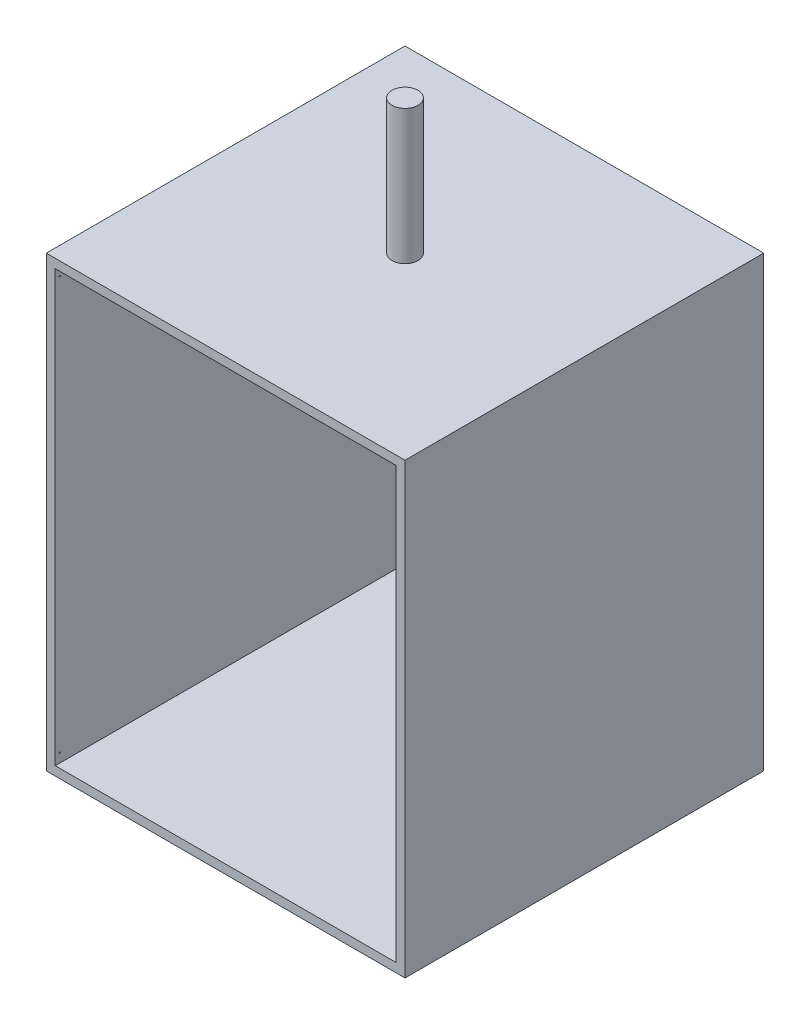
ISO-10303-21;
HEADER;
FILE_DESCRIPTION(('STEP AP214'),'2;1');
FILE_NAME('part.step','',(''),(''),'','','');
FILE_SCHEMA(('AUTOMOTIVE_DESIGN { 1 0 10303 214 1 1 1 1 }'));
ENDSEC;
DATA;
#1=APPLICATION_CONTEXT('core data for automotive mechanical design processes');
#2=APPLICATION_PROTOCOL_DEFINITION('international standard','automotive_design',2000,#1);
#3=PRODUCT_CONTEXT('',#1,'mechanical');
#4=PRODUCT('Part','Part','',(#3));
#5=PRODUCT_RELATED_PRODUCT_CATEGORY('part','',(#4));
#6=PRODUCT_DEFINITION_FORMATION('','',#4);
#7=PRODUCT_DEFINITION_CONTEXT('part definition',#1,'design');
#8=PRODUCT_DEFINITION('design','',#6,#7);
#9=PRODUCT_DEFINITION_SHAPE('','',#8);
#10=(LENGTH_UNIT() NAMED_UNIT(*) SI_UNIT(.MILLI.,.METRE.));
#11=(NAMED_UNIT(*) PLANE_ANGLE_UNIT() SI_UNIT($,.RADIAN.));
#12=(NAMED_UNIT(*) SI_UNIT($,.STERADIAN.) SOLID_ANGLE_UNIT());
#13=UNCERTAINTY_MEASURE_WITH_UNIT(LENGTH_MEASURE(1.E-05),#10,'distance_accuracy_value','');
#14=(GEOMETRIC_REPRESENTATION_CONTEXT(3) GLOBAL_UNCERTAINTY_ASSIGNED_CONTEXT((#13)) GLOBAL_UNIT_ASSIGNED_CONTEXT((#10,
#11,#12)) REPRESENTATION_CONTEXT('',''));
#15=CARTESIAN_POINT('',(0.,0.,0.));
#16=DIRECTION('',(0.,0.,1.));
#17=DIRECTION('',(1.,0.,0.));
#18=AXIS2_PLACEMENT_3D('',#15,#16,#17);
#19=CARTESIAN_POINT('',(200.,-250.,-400.));
#20=DIRECTION('',(1.,0.,0.));
#21=DIRECTION('',(0.,0.,-1.));
#22=AXIS2_PLACEMENT_3D('',#19,#20,#21);
#23=PLANE('',#22);
#24=DIRECTION('',(0.,1.,0.));
#25=VECTOR('',#24,1.);
#26=CARTESIAN_POINT('',(200.,-250.,0.));
#27=LINE('',#26,#25);
#28=CARTESIAN_POINT('',(200.,-250.,0.));
#29=VERTEX_POINT('',#28);
#30=CARTESIAN_POINT('',(200.,250.,0.));
#31=VERTEX_POINT('',#30);
#32=EDGE_CURVE('E167',#29,#31,#27,.T.);
#33=ORIENTED_EDGE('',*,*,#32,.F.);
#34=DIRECTION('',(0.,0.,1.));
#35=VECTOR('',#34,1.);
#36=CARTESIAN_POINT('',(200.,-250.,-400.));
#37=LINE('',#36,#35);
#38=CARTESIAN_POINT('',(200.,-250.,-400.));
#39=VERTEX_POINT('',#38);
#40=EDGE_CURVE('E11',#39,#29,#37,.T.);
#41=ORIENTED_EDGE('',*,*,#40,.F.);
#42=DIRECTION('',(0.,1.,0.));
#43=VECTOR('',#42,1.);
#44=CARTESIAN_POINT('',(200.,-250.,-400.));
#45=LINE('',#44,#43);
#46=CARTESIAN_POINT('',(200.,250.,-400.));
#47=VERTEX_POINT('',#46);
#48=EDGE_CURVE('E173',#39,#47,#45,.T.);
#49=ORIENTED_EDGE('',*,*,#48,.T.);
#50=DIRECTION('',(0.,0.,1.));
#51=VECTOR('',#50,1.);
#52=CARTESIAN_POINT('',(200.,250.,-400.));
#53=LINE('',#52,#51);
#54=EDGE_CURVE('E48',#47,#31,#53,.T.);
#55=ORIENTED_EDGE('',*,*,#54,.T.);
#56=EDGE_LOOP('',(#33,#41,#49,#55));
#57=FACE_BOUND('',#56,.T.);
#58=ADVANCED_FACE('F45',(#57),#23,.T.);
#59=CARTESIAN_POINT('',(-200.,-250.,-400.));
#60=DIRECTION('',(0.,-1.,0.));
#61=DIRECTION('',(0.,0.,-1.));
#62=AXIS2_PLACEMENT_3D('',#59,#60,#61);
#63=PLANE('',#62);
#64=DIRECTION('',(1.,0.,0.));
#65=VECTOR('',#64,1.);
#66=CARTESIAN_POINT('',(-200.,-250.,0.));
#67=LINE('',#66,#65);
#68=CARTESIAN_POINT('',(-200.,-250.,0.));
#69=VERTEX_POINT('',#68);
#70=EDGE_CURVE('E177',#69,#29,#67,.T.);
#71=ORIENTED_EDGE('',*,*,#70,.F.);
#72=DIRECTION('',(0.,0.,1.));
#73=VECTOR('',#72,1.);
#74=CARTESIAN_POINT('',(-200.,-250.,-400.));
#75=LINE('',#74,#73);
#76=CARTESIAN_POINT('',(-200.,-250.,-400.));
#77=VERTEX_POINT('',#76);
#78=EDGE_CURVE('E54',#77,#69,#75,.T.);
#79=ORIENTED_EDGE('',*,*,#78,.F.);
#80=DIRECTION('',(1.,0.,0.));
#81=VECTOR('',#80,1.);
#82=CARTESIAN_POINT('',(-200.,-250.,-400.));
#83=LINE('',#82,#81);
#84=EDGE_CURVE('E184',#77,#39,#83,.T.);
#85=ORIENTED_EDGE('',*,*,#84,.T.);
#86=ORIENTED_EDGE('',*,*,#40,.T.);
#87=EDGE_LOOP('',(#71,#79,#85,#86));
#88=FACE_BOUND('',#87,.T.);
#89=ADVANCED_FACE('F209',(#88),#63,.T.);
#90=CARTESIAN_POINT('',(-200.,-250.,-400.));
#91=DIRECTION('',(-1.,0.,0.));
#92=DIRECTION('',(0.,0.,1.));
#93=AXIS2_PLACEMENT_3D('',#90,#91,#92);
#94=PLANE('',#93);
#95=DIRECTION('',(0.,-1.,0.));
#96=VECTOR('',#95,1.);
#97=CARTESIAN_POINT('',(-200.,-250.,0.));
#98=LINE('',#97,#96);
#99=CARTESIAN_POINT('',(-200.,250.,0.));
#100=VERTEX_POINT('',#99);
#101=EDGE_CURVE('E194',#100,#69,#98,.T.);
#102=ORIENTED_EDGE('',*,*,#101,.F.);
#103=DIRECTION('',(0.,0.,1.));
#104=VECTOR('',#103,1.);
#105=CARTESIAN_POINT('',(-200.,250.,-400.));
#106=LINE('',#105,#104);
#107=CARTESIAN_POINT('',(-200.,250.,-400.));
#108=VERTEX_POINT('',#107);
#109=EDGE_CURVE('E202',#108,#100,#106,.T.);
#110=ORIENTED_EDGE('',*,*,#109,.F.);
#111=DIRECTION('',(0.,-1.,0.));
#112=VECTOR('',#111,1.);
#113=CARTESIAN_POINT('',(-200.,-250.,-400.));
#114=LINE('',#113,#112);
#115=EDGE_CURVE('E180',#108,#77,#114,.T.);
#116=ORIENTED_EDGE('',*,*,#115,.T.);
#117=ORIENTED_EDGE('',*,*,#78,.T.);
#118=EDGE_LOOP('',(#102,#110,#116,#117));
#119=FACE_BOUND('',#118,.T.);
#120=ADVANCED_FACE('F213',(#119),#94,.T.);
#121=CARTESIAN_POINT('',(-200.,250.,-400.));
#122=DIRECTION('',(0.,1.,0.));
#123=DIRECTION('',(0.,0.,1.));
#124=AXIS2_PLACEMENT_3D('',#121,#122,#123);
#125=PLANE('',#124);
#126=CARTESIAN_POINT('',(0.,250.,-200.));
#127=DIRECTION('',(0.,1.,0.));
#128=DIRECTION('',(0.,0.,1.));
#129=AXIS2_PLACEMENT_3D('',#126,#127,#128);
#130=CIRCLE('',#129,14.5);
#131=CARTESIAN_POINT('',(0.,250.,-185.5));
#132=VERTEX_POINT('',#131);
#133=EDGE_CURVE('E447',#132,#132,#130,.T.);
#134=ORIENTED_EDGE('',*,*,#133,.F.);
#135=EDGE_LOOP('',(#134));
#136=FACE_BOUND('',#135,.T.);
#137=DIRECTION('',(-1.,0.,0.));
#138=VECTOR('',#137,1.);
#139=CARTESIAN_POINT('',(-200.,250.,0.));
#140=LINE('',#139,#138);
#141=EDGE_CURVE('E190',#31,#100,#140,.T.);
#142=ORIENTED_EDGE('',*,*,#141,.F.);
#143=ORIENTED_EDGE('',*,*,#54,.F.);
#144=DIRECTION('',(-1.,0.,0.));
#145=VECTOR('',#144,1.);
#146=CARTESIAN_POINT('',(-200.,250.,-400.));
#147=LINE('',#146,#145);
#148=EDGE_CURVE('E176',#47,#108,#147,.T.);
#149=ORIENTED_EDGE('',*,*,#148,.T.);
#150=ORIENTED_EDGE('',*,*,#109,.T.);
#151=EDGE_LOOP('',(#142,#143,#149,#150));
#152=FACE_BOUND('',#151,.T.);
#153=ADVANCED_FACE('F206',(#136,#152),#125,.T.);
#154=CARTESIAN_POINT('',(0.,0.,-400.));
#155=DIRECTION('',(0.,0.,-1.));
#156=DIRECTION('',(-1.,0.,0.));
#157=AXIS2_PLACEMENT_3D('',#154,#155,#156);
#158=PLANE('',#157);
#159=CARTESIAN_POINT('',(0.,0.,-400.));
#160=DIRECTION('',(0.,0.,-1.));
#161=DIRECTION('',(-1.,0.,0.));
#162=AXIS2_PLACEMENT_3D('',#159,#160,#161);
#163=CIRCLE('',#162,25.5);
#164=CARTESIAN_POINT('',(-25.5,0.,-400.));
#165=VERTEX_POINT('',#164);
#166=EDGE_CURVE('E148',#165,#165,#163,.T.);
#167=ORIENTED_EDGE('',*,*,#166,.F.);
#168=EDGE_LOOP('',(#167));
#169=FACE_BOUND('',#168,.T.);
#170=ORIENTED_EDGE('',*,*,#48,.F.);
#171=ORIENTED_EDGE('',*,*,#84,.F.);
#172=ORIENTED_EDGE('',*,*,#115,.F.);
#173=ORIENTED_EDGE('',*,*,#148,.F.);
#174=EDGE_LOOP('',(#170,#171,#172,#173));
#175=FACE_BOUND('',#174,.T.);
#176=ADVANCED_FACE('F215',(#169,#175),#158,.T.);
#177=CARTESIAN_POINT('',(0.,0.,0.));
#178=DIRECTION('',(0.,0.,-1.));
#179=DIRECTION('',(-1.,0.,0.));
#180=AXIS2_PLACEMENT_3D('',#177,#178,#179);
#181=PLANE('',#180);
#182=DIRECTION('',(1.,0.,0.));
#183=VECTOR('',#182,1.);
#184=CARTESIAN_POINT('',(190.,-240.,0.));
#185=LINE('',#184,#183);
#186=CARTESIAN_POINT('',(-190.,-240.,0.));
#187=VERTEX_POINT('',#186);
#188=CARTESIAN_POINT('',(190.,-240.,0.));
#189=VERTEX_POINT('',#188);
#190=EDGE_CURVE('E157',#187,#189,#185,.T.);
#191=ORIENTED_EDGE('',*,*,#190,.F.);
#192=DIRECTION('',(0.,-1.,0.));
#193=VECTOR('',#192,1.);
#194=CARTESIAN_POINT('',(-190.,-240.,0.));
#195=LINE('',#194,#193);
#196=CARTESIAN_POINT('',(-190.,240.,0.));
#197=VERTEX_POINT('',#196);
#198=EDGE_CURVE('E62',#197,#187,#195,.T.);
#199=ORIENTED_EDGE('',*,*,#198,.F.);
#200=DIRECTION('',(-1.,0.,0.));
#201=VECTOR('',#200,1.);
#202=CARTESIAN_POINT('',(190.,240.,0.));
#203=LINE('',#202,#201);
#204=CARTESIAN_POINT('',(190.,240.,0.));
#205=VERTEX_POINT('',#204);
#206=EDGE_CURVE('E141',#205,#197,#203,.T.);
#207=ORIENTED_EDGE('',*,*,#206,.F.);
#208=DIRECTION('',(0.,1.,0.));
#209=VECTOR('',#208,1.);
#210=CARTESIAN_POINT('',(190.,-240.,0.));
#211=LINE('',#210,#209);
#212=EDGE_CURVE('E145',#189,#205,#211,.T.);
#213=ORIENTED_EDGE('',*,*,#212,.F.);
#214=EDGE_LOOP('',(#191,#199,#207,#213));
#215=FACE_BOUND('',#214,.T.);
#216=ORIENTED_EDGE('',*,*,#32,.T.);
#217=ORIENTED_EDGE('',*,*,#141,.T.);
#218=ORIENTED_EDGE('',*,*,#101,.T.);
#219=ORIENTED_EDGE('',*,*,#70,.T.);
#220=EDGE_LOOP('',(#216,#217,#218,#219));
#221=FACE_BOUND('',#220,.T.);
#222=ADVANCED_FACE('F208',(#215,#221),#181,.F.);
#223=CARTESIAN_POINT('',(-190.,-240.,-395.));
#224=DIRECTION('',(-1.,0.,0.));
#225=DIRECTION('',(0.,0.,1.));
#226=AXIS2_PLACEMENT_3D('',#223,#224,#225);
#227=PLANE('',#226);
#228=CARTESIAN_POINT('',(-190.,-230.,-5.00000000000006));
#229=DIRECTION('',(1.,0.,0.));
#230=DIRECTION('',(0.,0.,-1.));
#231=AXIS2_PLACEMENT_3D('',#228,#229,#230);
#232=CIRCLE('',#231,0.750000000000001);
#233=CARTESIAN_POINT('',(-190.,-230.,-5.75000000000006));
#234=VERTEX_POINT('',#233);
#235=EDGE_CURVE('E425',#234,#234,#232,.T.);
#236=ORIENTED_EDGE('',*,*,#235,.F.);
#237=EDGE_LOOP('',(#236));
#238=FACE_BOUND('',#237,.T.);
#239=CARTESIAN_POINT('',(-190.,230.,-5.));
#240=DIRECTION('',(1.,0.,0.));
#241=DIRECTION('',(0.,0.,-1.));
#242=AXIS2_PLACEMENT_3D('',#239,#240,#241);
#243=CIRCLE('',#242,0.75);
#244=CARTESIAN_POINT('',(-190.,230.,-5.75000000000001));
#245=VERTEX_POINT('',#244);
#246=EDGE_CURVE('E428',#245,#245,#243,.T.);
#247=ORIENTED_EDGE('',*,*,#246,.F.);
#248=EDGE_LOOP('',(#247));
#249=FACE_BOUND('',#248,.T.);
#250=ORIENTED_EDGE('',*,*,#198,.T.);
#251=DIRECTION('',(0.,0.,1.));
#252=VECTOR('',#251,1.);
#253=CARTESIAN_POINT('',(-190.,-240.,-395.));
#254=LINE('',#253,#252);
#255=CARTESIAN_POINT('',(-190.,-240.,-395.));
#256=VERTEX_POINT('',#255);
#257=EDGE_CURVE('E116',#256,#187,#254,.T.);
#258=ORIENTED_EDGE('',*,*,#257,.F.);
#259=DIRECTION('',(0.,-1.,0.));
#260=VECTOR('',#259,1.);
#261=CARTESIAN_POINT('',(-190.,-240.,-395.));
#262=LINE('',#261,#260);
#263=CARTESIAN_POINT('',(-190.,240.,-395.));
#264=VERTEX_POINT('',#263);
#265=EDGE_CURVE('E120',#264,#256,#262,.T.);
#266=ORIENTED_EDGE('',*,*,#265,.F.);
#267=DIRECTION('',(0.,0.,1.));
#268=VECTOR('',#267,1.);
#269=CARTESIAN_POINT('',(-190.,240.,-395.));
#270=LINE('',#269,#268);
#271=EDGE_CURVE('E164',#264,#197,#270,.T.);
#272=ORIENTED_EDGE('',*,*,#271,.T.);
#273=EDGE_LOOP('',(#250,#258,#266,#272));
#274=FACE_BOUND('',#273,.T.);
#275=ADVANCED_FACE('F118',(#238,#249,#274),#227,.F.);
#276=CARTESIAN_POINT('',(190.,240.,-395.));
#277=DIRECTION('',(0.,1.,0.));
#278=DIRECTION('',(0.,0.,1.));
#279=AXIS2_PLACEMENT_3D('',#276,#277,#278);
#280=PLANE('',#279);
#281=ORIENTED_EDGE('',*,*,#206,.T.);
#282=ORIENTED_EDGE('',*,*,#271,.F.);
#283=DIRECTION('',(-1.,0.,0.));
#284=VECTOR('',#283,1.);
#285=CARTESIAN_POINT('',(190.,240.,-395.));
#286=LINE('',#285,#284);
#287=CARTESIAN_POINT('',(190.,240.,-395.));
#288=VERTEX_POINT('',#287);
#289=EDGE_CURVE('E127',#288,#264,#286,.T.);
#290=ORIENTED_EDGE('',*,*,#289,.F.);
#291=DIRECTION('',(0.,0.,1.));
#292=VECTOR('',#291,1.);
#293=CARTESIAN_POINT('',(190.,240.,-395.));
#294=LINE('',#293,#292);
#295=EDGE_CURVE('E168',#288,#205,#294,.T.);
#296=ORIENTED_EDGE('',*,*,#295,.T.);
#297=EDGE_LOOP('',(#281,#282,#290,#296));
#298=FACE_BOUND('',#297,.T.);
#299=ADVANCED_FACE('F252',(#298),#280,.F.);
#300=CARTESIAN_POINT('',(190.,-240.,-395.));
#301=DIRECTION('',(1.,0.,0.));
#302=DIRECTION('',(0.,0.,-1.));
#303=AXIS2_PLACEMENT_3D('',#300,#301,#302);
#304=PLANE('',#303);
#305=CARTESIAN_POINT('',(190.,-230.,-4.99999999999995));
#306=DIRECTION('',(-1.,0.,0.));
#307=DIRECTION('',(0.,0.,1.));
#308=AXIS2_PLACEMENT_3D('',#305,#306,#307);
#309=CIRCLE('',#308,0.75);
#310=CARTESIAN_POINT('',(190.,-230.,-4.24999999999994));
#311=VERTEX_POINT('',#310);
#312=EDGE_CURVE('E488',#311,#311,#309,.T.);
#313=ORIENTED_EDGE('',*,*,#312,.F.);
#314=EDGE_LOOP('',(#313));
#315=FACE_BOUND('',#314,.T.);
#316=CARTESIAN_POINT('',(190.,230.,-5.));
#317=DIRECTION('',(-1.,0.,0.));
#318=DIRECTION('',(0.,0.,1.));
#319=AXIS2_PLACEMENT_3D('',#316,#317,#318);
#320=CIRCLE('',#319,0.750000000000001);
#321=CARTESIAN_POINT('',(190.,230.,-4.25));
#322=VERTEX_POINT('',#321);
#323=EDGE_CURVE('E437',#322,#322,#320,.T.);
#324=ORIENTED_EDGE('',*,*,#323,.F.);
#325=EDGE_LOOP('',(#324));
#326=FACE_BOUND('',#325,.T.);
#327=ORIENTED_EDGE('',*,*,#212,.T.);
#328=ORIENTED_EDGE('',*,*,#295,.F.);
#329=DIRECTION('',(0.,1.,0.));
#330=VECTOR('',#329,1.);
#331=CARTESIAN_POINT('',(190.,-240.,-395.));
#332=LINE('',#331,#330);
#333=CARTESIAN_POINT('',(190.,-240.,-395.));
#334=VERTEX_POINT('',#333);
#335=EDGE_CURVE('E136',#334,#288,#332,.T.);
#336=ORIENTED_EDGE('',*,*,#335,.F.);
#337=DIRECTION('',(0.,0.,1.));
#338=VECTOR('',#337,1.);
#339=CARTESIAN_POINT('',(190.,-240.,-395.));
#340=LINE('',#339,#338);
#341=EDGE_CURVE('E126',#334,#189,#340,.T.);
#342=ORIENTED_EDGE('',*,*,#341,.T.);
#343=EDGE_LOOP('',(#327,#328,#336,#342));
#344=FACE_BOUND('',#343,.T.);
#345=ADVANCED_FACE('F256',(#315,#326,#344),#304,.F.);
#346=CARTESIAN_POINT('',(190.,-240.,-395.));
#347=DIRECTION('',(0.,-1.,0.));
#348=DIRECTION('',(0.,0.,-1.));
#349=AXIS2_PLACEMENT_3D('',#346,#347,#348);
#350=PLANE('',#349);
#351=ORIENTED_EDGE('',*,*,#190,.T.);
#352=ORIENTED_EDGE('',*,*,#341,.F.);
#353=DIRECTION('',(1.,0.,0.));
#354=VECTOR('',#353,1.);
#355=CARTESIAN_POINT('',(190.,-240.,-395.));
#356=LINE('',#355,#354);
#357=EDGE_CURVE('E130',#256,#334,#356,.T.);
#358=ORIENTED_EDGE('',*,*,#357,.F.);
#359=ORIENTED_EDGE('',*,*,#257,.T.);
#360=EDGE_LOOP('',(#351,#352,#358,#359));
#361=FACE_BOUND('',#360,.T.);
#362=ADVANCED_FACE('F131',(#361),#350,.F.);
#363=CARTESIAN_POINT('',(0.,0.,-395.));
#364=DIRECTION('',(0.,0.,1.));
#365=DIRECTION('',(1.,0.,0.));
#366=AXIS2_PLACEMENT_3D('',#363,#364,#365);
#367=PLANE('',#366);
#368=ORIENTED_EDGE('',*,*,#265,.T.);
#369=ORIENTED_EDGE('',*,*,#357,.T.);
#370=ORIENTED_EDGE('',*,*,#335,.T.);
#371=ORIENTED_EDGE('',*,*,#289,.T.);
#372=EDGE_LOOP('',(#368,#369,#370,#371));
#373=FACE_BOUND('',#372,.T.);
#374=ADVANCED_FACE('F138',(#373),#367,.T.);
#375=CARTESIAN_POINT('',(0.,0.,-440.));
#376=DIRECTION('',(0.,0.,1.));
#377=DIRECTION('',(1.,0.,0.));
#378=AXIS2_PLACEMENT_3D('',#375,#376,#377);
#379=CYLINDRICAL_SURFACE('',#378,25.5);
#380=CARTESIAN_POINT('',(0.,0.,-440.));
#381=DIRECTION('',(0.,0.,-1.));
#382=DIRECTION('',(-1.,0.,0.));
#383=AXIS2_PLACEMENT_3D('',#380,#381,#382);
#384=CIRCLE('',#383,25.5);
#385=CARTESIAN_POINT('',(-25.5,0.,-440.));
#386=VERTEX_POINT('',#385);
#387=EDGE_CURVE('E158',#386,#386,#384,.T.);
#388=ORIENTED_EDGE('',*,*,#387,.F.);
#389=EDGE_LOOP('',(#388));
#390=FACE_BOUND('',#389,.T.);
#391=ORIENTED_EDGE('',*,*,#166,.T.);
#392=EDGE_LOOP('',(#391));
#393=FACE_BOUND('',#392,.T.);
#394=ADVANCED_FACE('F271',(#390,#393),#379,.T.);
#395=CARTESIAN_POINT('',(0.,0.,-440.));
#396=DIRECTION('',(0.,0.,-1.));
#397=DIRECTION('',(-1.,0.,0.));
#398=AXIS2_PLACEMENT_3D('',#395,#396,#397);
#399=PLANE('',#398);
#400=CARTESIAN_POINT('',(0.,0.,-440.));
#401=DIRECTION('',(0.,0.,-1.));
#402=DIRECTION('',(-1.,0.,0.));
#403=AXIS2_PLACEMENT_3D('',#400,#401,#402);
#404=CIRCLE('',#403,25.);
#405=CARTESIAN_POINT('',(-25.,0.,-440.));
#406=VERTEX_POINT('',#405);
#407=EDGE_CURVE('E455',#406,#406,#404,.T.);
#408=ORIENTED_EDGE('',*,*,#407,.F.);
#409=EDGE_LOOP('',(#408));
#410=FACE_BOUND('',#409,.T.);
#411=ORIENTED_EDGE('',*,*,#387,.T.);
#412=EDGE_LOOP('',(#411));
#413=FACE_BOUND('',#412,.T.);
#414=ADVANCED_FACE('F282',(#410,#413),#399,.T.);
#415=CARTESIAN_POINT('',(0.,0.,-410.));
#416=DIRECTION('',(0.,0.,-1.));
#417=DIRECTION('',(-1.,0.,0.));
#418=AXIS2_PLACEMENT_3D('',#415,#416,#417);
#419=CYLINDRICAL_SURFACE('',#418,25.);
#420=CARTESIAN_POINT('',(0.,0.,-410.));
#421=DIRECTION('',(0.,0.,-1.));
#422=DIRECTION('',(-1.,0.,0.));
#423=AXIS2_PLACEMENT_3D('',#420,#421,#422);
#424=CIRCLE('',#423,25.);
#425=CARTESIAN_POINT('',(-25.,0.,-410.));
#426=VERTEX_POINT('',#425);
#427=EDGE_CURVE('E459',#426,#426,#424,.T.);
#428=ORIENTED_EDGE('',*,*,#427,.F.);
#429=EDGE_LOOP('',(#428));
#430=FACE_BOUND('',#429,.T.);
#431=ORIENTED_EDGE('',*,*,#407,.T.);
#432=EDGE_LOOP('',(#431));
#433=FACE_BOUND('',#432,.T.);
#434=ADVANCED_FACE('F292',(#430,#433),#419,.F.);
#435=CARTESIAN_POINT('',(0.,0.,-410.));
#436=DIRECTION('',(0.,0.,-1.));
#437=DIRECTION('',(-1.,0.,0.));
#438=AXIS2_PLACEMENT_3D('',#435,#436,#437);
#439=PLANE('',#438);
#440=ORIENTED_EDGE('',*,*,#427,.T.);
#441=EDGE_LOOP('',(#440));
#442=FACE_BOUND('',#441,.T.);
#443=ADVANCED_FACE('F302',(#442),#439,.T.);
#444=CARTESIAN_POINT('',(0.,400.,-200.));
#445=DIRECTION('',(0.,-1.,0.));
#446=DIRECTION('',(0.,0.,-1.));
#447=AXIS2_PLACEMENT_3D('',#444,#445,#446);
#448=CYLINDRICAL_SURFACE('',#447,14.5);
#449=CARTESIAN_POINT('',(0.,400.,-200.));
#450=DIRECTION('',(0.,1.,0.));
#451=DIRECTION('',(0.,0.,1.));
#452=AXIS2_PLACEMENT_3D('',#449,#450,#451);
#453=CIRCLE('',#452,14.5);
#454=CARTESIAN_POINT('',(0.,400.,-185.5));
#455=VERTEX_POINT('',#454);
#456=EDGE_CURVE('E451',#455,#455,#453,.T.);
#457=ORIENTED_EDGE('',*,*,#456,.F.);
#458=EDGE_LOOP('',(#457));
#459=FACE_BOUND('',#458,.T.);
#460=ORIENTED_EDGE('',*,*,#133,.T.);
#461=EDGE_LOOP('',(#460));
#462=FACE_BOUND('',#461,.T.);
#463=ADVANCED_FACE('F312',(#459,#462),#448,.T.);
#464=CARTESIAN_POINT('',(0.,400.,-200.));
#465=DIRECTION('',(0.,1.,0.));
#466=DIRECTION('',(0.,0.,1.));
#467=AXIS2_PLACEMENT_3D('',#464,#465,#466);
#468=PLANE('',#467);
#469=ORIENTED_EDGE('',*,*,#456,.T.);
#470=EDGE_LOOP('',(#469));
#471=FACE_BOUND('',#470,.T.);
#472=ADVANCED_FACE('F322',(#471),#468,.T.);
#473=CARTESIAN_POINT('',(191.5,230.,-5.));
#474=DIRECTION('',(-1.,0.,0.));
#475=DIRECTION('',(0.,0.,1.));
#476=AXIS2_PLACEMENT_3D('',#473,#474,#475);
#477=CYLINDRICAL_SURFACE('',#476,0.750000000000001);
#478=CARTESIAN_POINT('',(191.5,230.,-5.));
#479=DIRECTION('',(-1.,0.,0.));
#480=DIRECTION('',(0.,0.,1.));
#481=AXIS2_PLACEMENT_3D('',#478,#479,#480);
#482=CIRCLE('',#481,0.750000000000001);
#483=CARTESIAN_POINT('',(191.5,230.,-4.25));
#484=VERTEX_POINT('',#483);
#485=EDGE_CURVE('E443',#484,#484,#482,.T.);
#486=ORIENTED_EDGE('',*,*,#485,.F.);
#487=EDGE_LOOP('',(#486));
#488=FACE_BOUND('',#487,.T.);
#489=ORIENTED_EDGE('',*,*,#323,.T.);
#490=EDGE_LOOP('',(#489));
#491=FACE_BOUND('',#490,.T.);
#492=ADVANCED_FACE('F332',(#488,#491),#477,.F.);
#493=CARTESIAN_POINT('',(191.5,230.,-5.));
#494=DIRECTION('',(-1.,0.,0.));
#495=DIRECTION('',(0.,0.,1.));
#496=AXIS2_PLACEMENT_3D('',#493,#494,#495);
#497=PLANE('',#496);
#498=ORIENTED_EDGE('',*,*,#485,.T.);
#499=EDGE_LOOP('',(#498));
#500=FACE_BOUND('',#499,.T.);
#501=ADVANCED_FACE('F342',(#500),#497,.T.);
#502=CARTESIAN_POINT('',(-191.5,230.,-5.));
#503=DIRECTION('',(1.,0.,0.));
#504=DIRECTION('',(0.,0.,-1.));
#505=AXIS2_PLACEMENT_3D('',#502,#503,#504);
#506=CYLINDRICAL_SURFACE('',#505,0.75);
#507=CARTESIAN_POINT('',(-191.5,230.,-5.));
#508=DIRECTION('',(1.,0.,0.));
#509=DIRECTION('',(0.,0.,-1.));
#510=AXIS2_PLACEMENT_3D('',#507,#508,#509);
#511=CIRCLE('',#510,0.75);
#512=CARTESIAN_POINT('',(-191.5,230.,-5.75000000000001));
#513=VERTEX_POINT('',#512);
#514=EDGE_CURVE('E431',#513,#513,#511,.T.);
#515=ORIENTED_EDGE('',*,*,#514,.F.);
#516=EDGE_LOOP('',(#515));
#517=FACE_BOUND('',#516,.T.);
#518=ORIENTED_EDGE('',*,*,#246,.T.);
#519=EDGE_LOOP('',(#518));
#520=FACE_BOUND('',#519,.T.);
#521=ADVANCED_FACE('F352',(#517,#520),#506,.F.);
#522=CARTESIAN_POINT('',(-191.5,230.,-5.));
#523=DIRECTION('',(1.,0.,0.));
#524=DIRECTION('',(0.,0.,-1.));
#525=AXIS2_PLACEMENT_3D('',#522,#523,#524);
#526=PLANE('',#525);
#527=ORIENTED_EDGE('',*,*,#514,.T.);
#528=EDGE_LOOP('',(#527));
#529=FACE_BOUND('',#528,.T.);
#530=ADVANCED_FACE('F362',(#529),#526,.T.);
#531=CARTESIAN_POINT('',(-191.5,-230.,-5.00000000000006));
#532=DIRECTION('',(1.,0.,0.));
#533=DIRECTION('',(0.,0.,-1.));
#534=AXIS2_PLACEMENT_3D('',#531,#532,#533);
#535=CYLINDRICAL_SURFACE('',#534,0.750000000000001);
#536=CARTESIAN_POINT('',(-191.5,-230.,-5.00000000000006));
#537=DIRECTION('',(1.,0.,0.));
#538=DIRECTION('',(0.,0.,-1.));
#539=AXIS2_PLACEMENT_3D('',#536,#537,#538);
#540=CIRCLE('',#539,0.750000000000001);
#541=CARTESIAN_POINT('',(-191.5,-230.,-5.75000000000006));
#542=VERTEX_POINT('',#541);
#543=EDGE_CURVE('E432',#542,#542,#540,.T.);
#544=ORIENTED_EDGE('',*,*,#543,.F.);
#545=EDGE_LOOP('',(#544));
#546=FACE_BOUND('',#545,.T.);
#547=ORIENTED_EDGE('',*,*,#235,.T.);
#548=EDGE_LOOP('',(#547));
#549=FACE_BOUND('',#548,.T.);
#550=ADVANCED_FACE('F372',(#546,#549),#535,.F.);
#551=CARTESIAN_POINT('',(-191.5,-230.,-5.00000000000006));
#552=DIRECTION('',(1.,0.,0.));
#553=DIRECTION('',(0.,0.,-1.));
#554=AXIS2_PLACEMENT_3D('',#551,#552,#553);
#555=PLANE('',#554);
#556=ORIENTED_EDGE('',*,*,#543,.T.);
#557=EDGE_LOOP('',(#556));
#558=FACE_BOUND('',#557,.T.);
#559=ADVANCED_FACE('F383',(#558),#555,.T.);
#560=CARTESIAN_POINT('',(191.5,-230.,-4.99999999999995));
#561=DIRECTION('',(-1.,0.,0.));
#562=DIRECTION('',(0.,0.,1.));
#563=AXIS2_PLACEMENT_3D('',#560,#561,#562);
#564=CYLINDRICAL_SURFACE('',#563,0.75);
#565=CARTESIAN_POINT('',(191.5,-230.,-4.99999999999995));
#566=DIRECTION('',(-1.,0.,0.));
#567=DIRECTION('',(0.,0.,1.));
#568=AXIS2_PLACEMENT_3D('',#565,#566,#567);
#569=CIRCLE('',#568,0.75);
#570=CARTESIAN_POINT('',(191.5,-230.,-4.24999999999994));
#571=VERTEX_POINT('',#570);
#572=EDGE_CURVE('E486',#571,#571,#569,.T.);
#573=ORIENTED_EDGE('',*,*,#572,.F.);
#574=EDGE_LOOP('',(#573));
#575=FACE_BOUND('',#574,.T.);
#576=ORIENTED_EDGE('',*,*,#312,.T.);
#577=EDGE_LOOP('',(#576));
#578=FACE_BOUND('',#577,.T.);
#579=ADVANCED_FACE('F393',(#575,#578),#564,.F.);
#580=CARTESIAN_POINT('',(191.5,-230.,-4.99999999999995));
#581=DIRECTION('',(-1.,0.,0.));
#582=DIRECTION('',(0.,0.,1.));
#583=AXIS2_PLACEMENT_3D('',#580,#581,#582);
#584=PLANE('',#583);
#585=ORIENTED_EDGE('',*,*,#572,.T.);
#586=EDGE_LOOP('',(#585));
#587=FACE_BOUND('',#586,.T.);
#588=ADVANCED_FACE('F404',(#587),#584,.T.);
#589=CLOSED_SHELL('',(#58,#89,#120,#153,#176,#222,#275,#299,#345,#362,#374,#394,#414,#434,#443,
#463,#472,#492,#501,#521,#530,#550,#559,#579,#588));
#590=MANIFOLD_SOLID_BREP('B2',#589);
#591=ADVANCED_BREP_SHAPE_REPRESENTATION('',(#18,#590),#14);
#592=SHAPE_DEFINITION_REPRESENTATION(#9,#591);
ENDSEC;
END-ISO-10303-21;
